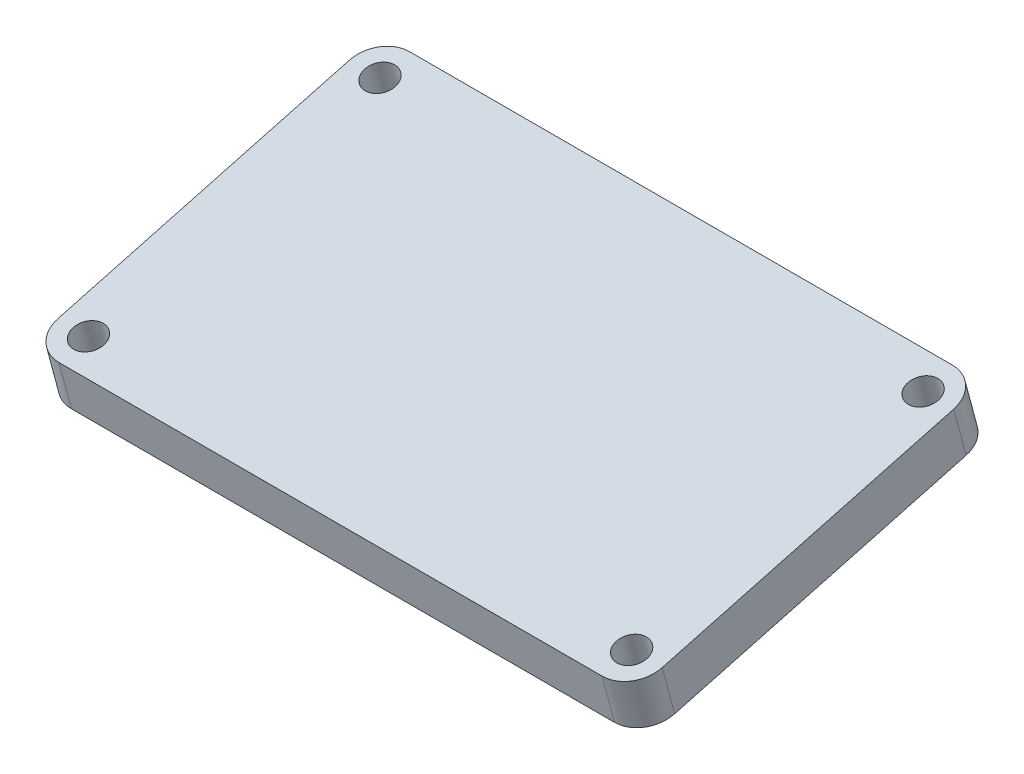
ISO-10303-21;
HEADER;
FILE_DESCRIPTION(('STEP AP214'),'2;1');
FILE_NAME('part.step','',(''),(''),'','','');
FILE_SCHEMA(('AUTOMOTIVE_DESIGN { 1 0 10303 214 1 1 1 1 }'));
ENDSEC;
DATA;
#1=APPLICATION_CONTEXT('core data for automotive mechanical design processes');
#2=APPLICATION_PROTOCOL_DEFINITION('international standard','automotive_design',2000,#1);
#3=PRODUCT_CONTEXT('',#1,'mechanical');
#4=PRODUCT('Part','Part','',(#3));
#5=PRODUCT_RELATED_PRODUCT_CATEGORY('part','',(#4));
#6=PRODUCT_DEFINITION_FORMATION('','',#4);
#7=PRODUCT_DEFINITION_CONTEXT('part definition',#1,'design');
#8=PRODUCT_DEFINITION('design','',#6,#7);
#9=PRODUCT_DEFINITION_SHAPE('','',#8);
#10=(LENGTH_UNIT() NAMED_UNIT(*) SI_UNIT(.MILLI.,.METRE.));
#11=(NAMED_UNIT(*) PLANE_ANGLE_UNIT() SI_UNIT($,.RADIAN.));
#12=(NAMED_UNIT(*) SI_UNIT($,.STERADIAN.) SOLID_ANGLE_UNIT());
#13=UNCERTAINTY_MEASURE_WITH_UNIT(LENGTH_MEASURE(1.E-05),#10,'distance_accuracy_value','');
#14=(GEOMETRIC_REPRESENTATION_CONTEXT(3) GLOBAL_UNCERTAINTY_ASSIGNED_CONTEXT((#13)) GLOBAL_UNIT_ASSIGNED_CONTEXT((#10,
#11,#12)) REPRESENTATION_CONTEXT('',''));
#15=CARTESIAN_POINT('',(0.,0.,0.));
#16=DIRECTION('',(0.,0.,1.));
#17=DIRECTION('',(1.,0.,0.));
#18=AXIS2_PLACEMENT_3D('',#15,#16,#17);
#19=CARTESIAN_POINT('',(40.0538061,293.775918617498,406.13245097417));
#20=DIRECTION('',(1.,0.,0.));
#21=DIRECTION('',(0.,0.,-1.));
#22=AXIS2_PLACEMENT_3D('',#19,#20,#21);
#23=PLANE('',#22);
#24=DIRECTION('',(0.,0.258819045102521,-0.965925826289068));
#25=VECTOR('',#24,1.);
#26=CARTESIAN_POINT('',(40.0538061,299.909547614434,407.775951910571));
#27=LINE('',#26,#25);
#28=CARTESIAN_POINT('',(40.0538061,294.733166712383,427.094468436353));
#29=VERTEX_POINT('',#28);
#30=CARTESIAN_POINT('',(40.0538061,305.085928516484,388.45743538479));
#31=VERTEX_POINT('',#30);
#32=EDGE_CURVE('E145',#29,#31,#27,.T.);
#33=ORIENTED_EDGE('',*,*,#32,.F.);
#34=DIRECTION('',(0.,0.965925826289068,0.258819045102521));
#35=VECTOR('',#34,1.);
#36=CARTESIAN_POINT('',(40.0538061,288.599537715447,425.450967499952));
#37=LINE('',#36,#35);
#38=CARTESIAN_POINT('',(40.0538061,288.599537715447,425.450967499952));
#39=VERTEX_POINT('',#38);
#40=EDGE_CURVE('E11',#39,#29,#37,.T.);
#41=ORIENTED_EDGE('',*,*,#40,.F.);
#42=DIRECTION('',(0.,0.258819045102521,-0.965925826289068));
#43=VECTOR('',#42,1.);
#44=CARTESIAN_POINT('',(40.0538061,293.775918617498,406.13245097417));
#45=LINE('',#44,#43);
#46=CARTESIAN_POINT('',(40.0538061,298.952299519548,386.813934448389));
#47=VERTEX_POINT('',#46);
#48=EDGE_CURVE('E328',#39,#47,#45,.T.);
#49=ORIENTED_EDGE('',*,*,#48,.T.);
#50=DIRECTION('',(0.,0.965925826289068,0.258819045102521));
#51=VECTOR('',#50,1.);
#52=CARTESIAN_POINT('',(40.0538061,298.952299519548,386.813934448389));
#53=LINE('',#52,#51);
#54=EDGE_CURVE('E69',#47,#31,#53,.T.);
#55=ORIENTED_EDGE('',*,*,#54,.T.);
#56=EDGE_LOOP('',(#33,#41,#49,#55));
#57=FACE_BOUND('',#56,.T.);
#58=ADVANCED_FACE('F17',(#57),#23,.T.);
#59=CARTESIAN_POINT('',(36.0000061,288.599537715447,425.450967499952));
#60=DIRECTION('',(0.,0.965925826289068,0.258819045102521));
#61=DIRECTION('',(0.,-0.258819045102521,0.965925826289068));
#62=AXIS2_PLACEMENT_3D('',#59,#60,#61);
#63=CYLINDRICAL_SURFACE('',#62,4.05380000000005);
#64=CARTESIAN_POINT('',(36.0000061,294.733166712383,427.094468436353));
#65=DIRECTION('',(0.,-0.965925826289068,-0.258819045102521));
#66=DIRECTION('',(0.,0.258819045102521,-0.965925826289068));
#67=AXIS2_PLACEMENT_3D('',#64,#65,#66);
#68=CIRCLE('',#67,4.05380000000005);
#69=CARTESIAN_POINT('',(36.0000061,293.683966067347,431.010138550963));
#70=VERTEX_POINT('',#69);
#71=EDGE_CURVE('E142',#29,#70,#68,.T.);
#72=ORIENTED_EDGE('',*,*,#71,.T.);
#73=DIRECTION('',(0.,0.965925826289068,0.258819045102521));
#74=VECTOR('',#73,1.);
#75=CARTESIAN_POINT('',(36.0000061,287.550337070411,429.366637614562));
#76=LINE('',#75,#74);
#77=CARTESIAN_POINT('',(36.0000061,287.550337070411,429.366637614562));
#78=VERTEX_POINT('',#77);
#79=EDGE_CURVE('E27',#78,#70,#76,.T.);
#80=ORIENTED_EDGE('',*,*,#79,.F.);
#81=CARTESIAN_POINT('',(36.0000061,288.599537715447,425.450967499952));
#82=DIRECTION('',(0.,-0.965925826289068,-0.258819045102521));
#83=DIRECTION('',(0.,0.258819045102521,-0.965925826289068));
#84=AXIS2_PLACEMENT_3D('',#81,#82,#83);
#85=CIRCLE('',#84,4.05380000000005);
#86=EDGE_CURVE('E324',#39,#78,#85,.T.);
#87=ORIENTED_EDGE('',*,*,#86,.F.);
#88=ORIENTED_EDGE('',*,*,#40,.T.);
#89=EDGE_LOOP('',(#72,#80,#87,#88));
#90=FACE_BOUND('',#89,.T.);
#91=ADVANCED_FACE('F143',(#90),#63,.T.);
#92=CARTESIAN_POINT('',(0.,287.550337070411,429.366637614562));
#93=DIRECTION('',(0.,-0.258819045102521,0.965925826289068));
#94=DIRECTION('',(0.,-0.965925826289068,-0.258819045102521));
#95=AXIS2_PLACEMENT_3D('',#92,#93,#94);
#96=PLANE('',#95);
#97=DIRECTION('',(1.,0.,0.));
#98=VECTOR('',#97,1.);
#99=CARTESIAN_POINT('',(0.,293.683966067347,431.010138550963));
#100=LINE('',#99,#98);
#101=CARTESIAN_POINT('',(-36.0000061,293.683966067347,431.010138550963));
#102=VERTEX_POINT('',#101);
#103=EDGE_CURVE('E137',#102,#70,#100,.T.);
#104=ORIENTED_EDGE('',*,*,#103,.F.);
#105=DIRECTION('',(0.,0.965925826289068,0.258819045102521));
#106=VECTOR('',#105,1.);
#107=CARTESIAN_POINT('',(-36.0000061,287.550337070411,429.366637614562));
#108=LINE('',#107,#106);
#109=CARTESIAN_POINT('',(-36.0000061,287.550337070411,429.366637614562));
#110=VERTEX_POINT('',#109);
#111=EDGE_CURVE('E126',#110,#102,#108,.T.);
#112=ORIENTED_EDGE('',*,*,#111,.F.);
#113=DIRECTION('',(1.,0.,0.));
#114=VECTOR('',#113,1.);
#115=CARTESIAN_POINT('',(0.,287.550337070411,429.366637614562));
#116=LINE('',#115,#114);
#117=EDGE_CURVE('E139',#110,#78,#116,.T.);
#118=ORIENTED_EDGE('',*,*,#117,.T.);
#119=ORIENTED_EDGE('',*,*,#79,.T.);
#120=EDGE_LOOP('',(#104,#112,#118,#119));
#121=FACE_BOUND('',#120,.T.);
#122=ADVANCED_FACE('F135',(#121),#96,.T.);
#123=CARTESIAN_POINT('',(-36.0000060999999,288.599537715447,425.450967499952));
#124=DIRECTION('',(0.,0.965925826289068,0.258819045102521));
#125=DIRECTION('',(0.,-0.258819045102521,0.965925826289068));
#126=AXIS2_PLACEMENT_3D('',#123,#124,#125);
#127=CYLINDRICAL_SURFACE('',#126,4.05380000000005);
#128=CARTESIAN_POINT('',(-36.0000060999999,294.733166712383,427.094468436353));
#129=DIRECTION('',(0.,-0.965925826289068,-0.258819045102521));
#130=DIRECTION('',(0.,0.258819045102521,-0.965925826289068));
#131=AXIS2_PLACEMENT_3D('',#128,#129,#130);
#132=CIRCLE('',#131,4.05380000000005);
#133=CARTESIAN_POINT('',(-40.0538061,294.733166712383,427.094468436353));
#134=VERTEX_POINT('',#133);
#135=EDGE_CURVE('E150',#102,#134,#132,.T.);
#136=ORIENTED_EDGE('',*,*,#135,.T.);
#137=DIRECTION('',(0.,0.965925826289068,0.258819045102521));
#138=VECTOR('',#137,1.);
#139=CARTESIAN_POINT('',(-40.0538061,288.599537715447,425.450967499952));
#140=LINE('',#139,#138);
#141=CARTESIAN_POINT('',(-40.0538061,288.599537715447,425.450967499952));
#142=VERTEX_POINT('',#141);
#143=EDGE_CURVE('E117',#142,#134,#140,.T.);
#144=ORIENTED_EDGE('',*,*,#143,.F.);
#145=CARTESIAN_POINT('',(-36.0000060999999,288.599537715447,425.450967499952));
#146=DIRECTION('',(0.,-0.965925826289068,-0.258819045102521));
#147=DIRECTION('',(0.,0.258819045102521,-0.965925826289068));
#148=AXIS2_PLACEMENT_3D('',#145,#146,#147);
#149=CIRCLE('',#148,4.05380000000005);
#150=EDGE_CURVE('E321',#110,#142,#149,.T.);
#151=ORIENTED_EDGE('',*,*,#150,.F.);
#152=ORIENTED_EDGE('',*,*,#111,.T.);
#153=EDGE_LOOP('',(#136,#144,#151,#152));
#154=FACE_BOUND('',#153,.T.);
#155=ADVANCED_FACE('F239',(#154),#127,.T.);
#156=CARTESIAN_POINT('',(-40.0538061,293.775918617498,406.13245097417));
#157=DIRECTION('',(1.,0.,0.));
#158=DIRECTION('',(0.,0.,-1.));
#159=AXIS2_PLACEMENT_3D('',#156,#157,#158);
#160=PLANE('',#159);
#161=DIRECTION('',(0.,0.258819045102521,-0.965925826289068));
#162=VECTOR('',#161,1.);
#163=CARTESIAN_POINT('',(-40.0538061,299.909547614434,407.775951910571));
#164=LINE('',#163,#162);
#165=CARTESIAN_POINT('',(-40.0538061,305.085928516484,388.45743538479));
#166=VERTEX_POINT('',#165);
#167=EDGE_CURVE('E153',#134,#166,#164,.T.);
#168=ORIENTED_EDGE('',*,*,#167,.T.);
#169=DIRECTION('',(0.,0.965925826289068,0.258819045102521));
#170=VECTOR('',#169,1.);
#171=CARTESIAN_POINT('',(-40.0538061,298.952299519548,386.813934448389));
#172=LINE('',#171,#170);
#173=CARTESIAN_POINT('',(-40.0538061,298.952299519548,386.813934448389));
#174=VERTEX_POINT('',#173);
#175=EDGE_CURVE('E112',#174,#166,#172,.T.);
#176=ORIENTED_EDGE('',*,*,#175,.F.);
#177=DIRECTION('',(0.,0.258819045102521,-0.965925826289068));
#178=VECTOR('',#177,1.);
#179=CARTESIAN_POINT('',(-40.0538061,293.775918617498,406.13245097417));
#180=LINE('',#179,#178);
#181=EDGE_CURVE('E103',#142,#174,#180,.T.);
#182=ORIENTED_EDGE('',*,*,#181,.F.);
#183=ORIENTED_EDGE('',*,*,#143,.T.);
#184=EDGE_LOOP('',(#168,#176,#182,#183));
#185=FACE_BOUND('',#184,.T.);
#186=ADVANCED_FACE('F236',(#185),#160,.F.);
#187=CARTESIAN_POINT('',(-36.0000061000001,298.952299519548,386.813934448389));
#188=DIRECTION('',(0.,0.965925826289068,0.258819045102521));
#189=DIRECTION('',(0.,-0.258819045102521,0.965925826289068));
#190=AXIS2_PLACEMENT_3D('',#187,#188,#189);
#191=CYLINDRICAL_SURFACE('',#190,4.0538);
#192=CARTESIAN_POINT('',(-36.0000061000001,305.085928516484,388.45743538479));
#193=DIRECTION('',(0.,-0.965925826289068,-0.258819045102521));
#194=DIRECTION('',(0.,0.258819045102521,-0.965925826289068));
#195=AXIS2_PLACEMENT_3D('',#192,#193,#194);
#196=CIRCLE('',#195,4.0538);
#197=CARTESIAN_POINT('',(-36.0000061,306.135129161521,384.541765270179));
#198=VERTEX_POINT('',#197);
#199=EDGE_CURVE('E110',#166,#198,#196,.T.);
#200=ORIENTED_EDGE('',*,*,#199,.T.);
#201=DIRECTION('',(0.,0.965925826289068,0.258819045102521));
#202=VECTOR('',#201,1.);
#203=CARTESIAN_POINT('',(-36.0000061,300.001500164585,382.898264333778));
#204=LINE('',#203,#202);
#205=CARTESIAN_POINT('',(-36.0000061,300.001500164585,382.898264333778));
#206=VERTEX_POINT('',#205);
#207=EDGE_CURVE('E94',#206,#198,#204,.T.);
#208=ORIENTED_EDGE('',*,*,#207,.F.);
#209=CARTESIAN_POINT('',(-36.0000061000001,298.952299519548,386.813934448389));
#210=DIRECTION('',(0.,-0.965925826289068,-0.258819045102521));
#211=DIRECTION('',(0.,0.258819045102521,-0.965925826289068));
#212=AXIS2_PLACEMENT_3D('',#209,#210,#211);
#213=CIRCLE('',#212,4.0538);
#214=EDGE_CURVE('E98',#174,#206,#213,.T.);
#215=ORIENTED_EDGE('',*,*,#214,.F.);
#216=ORIENTED_EDGE('',*,*,#175,.T.);
#217=EDGE_LOOP('',(#200,#208,#215,#216));
#218=FACE_BOUND('',#217,.T.);
#219=ADVANCED_FACE('F109',(#218),#191,.T.);
#220=CARTESIAN_POINT('',(0.,300.001500164585,382.898264333778));
#221=DIRECTION('',(0.,-0.258819045102521,0.965925826289068));
#222=DIRECTION('',(0.,-0.965925826289068,-0.258819045102521));
#223=AXIS2_PLACEMENT_3D('',#220,#221,#222);
#224=PLANE('',#223);
#225=DIRECTION('',(1.,0.,0.));
#226=VECTOR('',#225,1.);
#227=CARTESIAN_POINT('',(0.,306.135129161521,384.541765270179));
#228=LINE('',#227,#226);
#229=CARTESIAN_POINT('',(36.0000061,306.135129161521,384.541765270179));
#230=VERTEX_POINT('',#229);
#231=EDGE_CURVE('E162',#198,#230,#228,.T.);
#232=ORIENTED_EDGE('',*,*,#231,.T.);
#233=DIRECTION('',(0.,0.965925826289068,0.258819045102521));
#234=VECTOR('',#233,1.);
#235=CARTESIAN_POINT('',(36.0000061,300.001500164585,382.898264333778));
#236=LINE('',#235,#234);
#237=CARTESIAN_POINT('',(36.0000061,300.001500164585,382.898264333778));
#238=VERTEX_POINT('',#237);
#239=EDGE_CURVE('E96',#238,#230,#236,.T.);
#240=ORIENTED_EDGE('',*,*,#239,.F.);
#241=DIRECTION('',(1.,0.,0.));
#242=VECTOR('',#241,1.);
#243=CARTESIAN_POINT('',(0.,300.001500164585,382.898264333778));
#244=LINE('',#243,#242);
#245=EDGE_CURVE('E89',#206,#238,#244,.T.);
#246=ORIENTED_EDGE('',*,*,#245,.F.);
#247=ORIENTED_EDGE('',*,*,#207,.T.);
#248=EDGE_LOOP('',(#232,#240,#246,#247));
#249=FACE_BOUND('',#248,.T.);
#250=ADVANCED_FACE('F92',(#249),#224,.F.);
#251=CARTESIAN_POINT('',(-36.,288.599537715447,425.450967499952));
#252=DIRECTION('',(0.,0.965925826289068,0.258819045102521));
#253=DIRECTION('',(0.,-0.258819045102521,0.965925826289068));
#254=AXIS2_PLACEMENT_3D('',#251,#252,#253);
#255=CYLINDRICAL_SURFACE('',#254,2.0193);
#256=CARTESIAN_POINT('',(-36.,288.599537715447,425.450967499952));
#257=DIRECTION('',(0.,-0.965925826289068,-0.258819045102521));
#258=DIRECTION('',(0.,0.258819045102521,-0.965925826289068));
#259=AXIS2_PLACEMENT_3D('',#256,#257,#258);
#260=CIRCLE('',#259,2.0193);
#261=CARTESIAN_POINT('',(-36.,288.076904417672,427.401461520977));
#262=VERTEX_POINT('',#261);
#263=EDGE_CURVE('E337',#262,#262,#260,.T.);
#264=CARTESIAN_POINT('',(-36.,294.733166712383,427.094468436353));
#265=DIRECTION('',(0.,-0.965925826289068,-0.258819045102521));
#266=DIRECTION('',(0.,0.258819045102521,-0.965925826289068));
#267=AXIS2_PLACEMENT_3D('',#264,#265,#266);
#268=CIRCLE('',#267,2.0193);
#269=CARTESIAN_POINT('',(-36.,294.210533414607,429.044962457378));
#270=VERTEX_POINT('',#269);
#271=EDGE_CURVE('E182',#270,#270,#268,.T.);
#272=CARTESIAN_POINT('',(-36.,288.076904417672,427.401461520977));
#273=CARTESIAN_POINT('',(-36.,288.14079638639,427.418581322398));
#274=CARTESIAN_POINT('',(-36.,288.204688355108,427.435701123819));
#275=CARTESIAN_POINT('',(-36.,288.332472292544,427.46994072666));
#276=CARTESIAN_POINT('',(-36.,288.396364261262,427.487060528081));
#277=CARTESIAN_POINT('',(-36.,288.524148198698,427.521300130923));
#278=CARTESIAN_POINT('',(-36.,288.588040167417,427.538419932344));
#279=CARTESIAN_POINT('',(-36.,288.715824104853,427.572659535185));
#280=CARTESIAN_POINT('',(-36.,288.779716073571,427.589779336606));
#281=CARTESIAN_POINT('',(-36.,288.907500011007,427.624018939448));
#282=CARTESIAN_POINT('',(-36.,288.971391979725,427.641138740869));
#283=CARTESIAN_POINT('',(-36.,289.099175917161,427.675378343711));
#284=CARTESIAN_POINT('',(-36.,289.163067885879,427.692498145131));
#285=CARTESIAN_POINT('',(-36.,289.290851823315,427.726737747973));
#286=CARTESIAN_POINT('',(-36.,289.354743792034,427.743857549394));
#287=CARTESIAN_POINT('',(-36.,289.48252772947,427.778097152236));
#288=CARTESIAN_POINT('',(-36.,289.546419698188,427.795216953656));
#289=CARTESIAN_POINT('',(-36.,289.674203635624,427.829456556498));
#290=CARTESIAN_POINT('',(-36.,289.738095604342,427.846576357919));
#291=CARTESIAN_POINT('',(-36.,289.865879541778,427.880815960761));
#292=CARTESIAN_POINT('',(-36.,289.929771510496,427.897935762182));
#293=CARTESIAN_POINT('',(-36.,290.057555447932,427.932175365023));
#294=CARTESIAN_POINT('',(-36.,290.12144741665,427.949295166444));
#295=CARTESIAN_POINT('',(-36.,290.249231354087,427.983534769286));
#296=CARTESIAN_POINT('',(-36.,290.313123322805,428.000654570707));
#297=CARTESIAN_POINT('',(-36.,290.440907260241,428.034894173548));
#298=CARTESIAN_POINT('',(-36.,290.504799228959,428.052013974969));
#299=CARTESIAN_POINT('',(-36.,290.632583166395,428.086253577811));
#300=CARTESIAN_POINT('',(-36.,290.696475135113,428.103373379232));
#301=CARTESIAN_POINT('',(-36.,290.824259072549,428.137612982073));
#302=CARTESIAN_POINT('',(-36.,290.888151041267,428.154732783494));
#303=CARTESIAN_POINT('',(-36.,291.015934978704,428.188972386336));
#304=CARTESIAN_POINT('',(-36.,291.079826947422,428.206092187757));
#305=CARTESIAN_POINT('',(-36.,291.207610884858,428.240331790598));
#306=CARTESIAN_POINT('',(-36.,291.271502853576,428.257451592019));
#307=CARTESIAN_POINT('',(-36.,291.399286791012,428.291691194861));
#308=CARTESIAN_POINT('',(-36.,291.46317875973,428.308810996282));
#309=CARTESIAN_POINT('',(-36.,291.590962697166,428.343050599124));
#310=CARTESIAN_POINT('',(-36.,291.654854665884,428.360170400544));
#311=CARTESIAN_POINT('',(-36.,291.78263860332,428.394410003386));
#312=CARTESIAN_POINT('',(-36.,291.846530572039,428.411529804807));
#313=CARTESIAN_POINT('',(-36.,291.974314509475,428.445769407649));
#314=CARTESIAN_POINT('',(-36.,292.038206478193,428.462889209069));
#315=CARTESIAN_POINT('',(-36.,292.165990415629,428.497128811911));
#316=CARTESIAN_POINT('',(-36.,292.229882384347,428.514248613332));
#317=CARTESIAN_POINT('',(-36.,292.357666321783,428.548488216174));
#318=CARTESIAN_POINT('',(-36.,292.421558290501,428.565608017594));
#319=CARTESIAN_POINT('',(-36.,292.549342227937,428.599847620436));
#320=CARTESIAN_POINT('',(-36.,292.613234196655,428.616967421857));
#321=CARTESIAN_POINT('',(-36.,292.741018134092,428.651207024699));
#322=CARTESIAN_POINT('',(-36.,292.80491010281,428.668326826119));
#323=CARTESIAN_POINT('',(-36.,292.932694040246,428.702566428961));
#324=CARTESIAN_POINT('',(-36.,292.996586008964,428.719686230382));
#325=CARTESIAN_POINT('',(-36.,293.1243699464,428.753925833224));
#326=CARTESIAN_POINT('',(-36.,293.188261915118,428.771045634645));
#327=CARTESIAN_POINT('',(-36.,293.316045852554,428.805285237486));
#328=CARTESIAN_POINT('',(-36.,293.379937821272,428.822405038907));
#329=CARTESIAN_POINT('',(-36.,293.507721758709,428.856644641749));
#330=CARTESIAN_POINT('',(-36.,293.571613727427,428.87376444317));
#331=CARTESIAN_POINT('',(-36.,293.699397664863,428.908004046011));
#332=CARTESIAN_POINT('',(-36.,293.763289633581,428.925123847432));
#333=CARTESIAN_POINT('',(-36.,293.891073571017,428.959363450274));
#334=CARTESIAN_POINT('',(-36.,293.954965539735,428.976483251695));
#335=CARTESIAN_POINT('',(-36.,294.082749477171,429.010722854536));
#336=CARTESIAN_POINT('',(-36.,294.146641445889,429.027842655957));
#337=CARTESIAN_POINT('',(-36.,294.210533414607,429.044962457378));
#338=B_SPLINE_CURVE_WITH_KNOTS('',3,(#272,#273,#274,#275,#276,#277,#278,#279,#280,#281,#282,
#283,#284,#285,#286,#287,#288,#289,#290,#291,#292,#293,#294,#295,#296,#297,#298,#299,#300,#301,
#302,#303,#304,#305,#306,#307,#308,#309,#310,#311,#312,#313,#314,#315,#316,#317,#318,#319,#320,
#321,#322,#323,#324,#325,#326,#327,#328,#329,#330,#331,#332,#333,#334,#335,#336,#337),
.UNSPECIFIED.,.F.,.F.,(4,2,2,2,2,2,2,2,2,2,2,2,2,2,2,2,2,2,2,2,2,2,2,2,2,2,2,2,2,2,2,2,4),(0.,
0.198437499999976,0.396874999999937,0.595312499999967,0.793749999999943,0.992187499999972,
1.19062499999995,1.38906249999998,1.58749999999994,1.78593749999992,1.98437499999994,
2.18281249999992,2.38124999999995,2.57968749999991,2.77812499999994,2.97656249999992,
3.17499999999989,3.37343749999992,3.5718749999999,3.77031249999991,3.96874999999989,
4.16718749999992,4.36562499999989,4.56406249999992,4.76249999999988,4.96093749999986,
5.15937499999989,5.35781249999987,5.55624999999989,5.75468749999986,5.95312499999989,
6.15156249999986,6.34999999999984),.UNSPECIFIED.);
#339=EDGE_CURVE('BSEAM195',#262,#270,#338,.T.);
#340=ORIENTED_EDGE('',*,*,#263,.T.);
#341=ORIENTED_EDGE('',*,*,#271,.F.);
#342=ORIENTED_EDGE('',*,*,#339,.T.);
#343=ORIENTED_EDGE('',*,*,#339,.F.);
#344=EDGE_LOOP('',(#340,#342,#341,#343));
#345=FACE_BOUND('',#344,.T.);
#346=ADVANCED_FACE('F195',(#345),#255,.F.);
#347=CARTESIAN_POINT('',(-36.,298.952299519548,386.813934448389));
#348=DIRECTION('',(0.,0.965925826289068,0.258819045102521));
#349=DIRECTION('',(0.,-0.258819045102521,0.965925826289068));
#350=AXIS2_PLACEMENT_3D('',#347,#348,#349);
#351=CYLINDRICAL_SURFACE('',#350,2.0193);
#352=CARTESIAN_POINT('',(-36.,298.952299519548,386.813934448389));
#353=DIRECTION('',(0.,-0.965925826289068,-0.258819045102521));
#354=DIRECTION('',(0.,0.258819045102521,-0.965925826289068));
#355=AXIS2_PLACEMENT_3D('',#352,#353,#354);
#356=CIRCLE('',#355,2.0193);
#357=CARTESIAN_POINT('',(-36.,298.429666221773,388.764428469415));
#358=VERTEX_POINT('',#357);
#359=EDGE_CURVE('E338',#358,#358,#356,.T.);
#360=CARTESIAN_POINT('',(-36.,305.085928516484,388.45743538479));
#361=DIRECTION('',(0.,-0.965925826289068,-0.258819045102521));
#362=DIRECTION('',(0.,0.258819045102521,-0.965925826289068));
#363=AXIS2_PLACEMENT_3D('',#360,#361,#362);
#364=CIRCLE('',#363,2.0193);
#365=CARTESIAN_POINT('',(-36.,304.563295218708,390.407929405816));
#366=VERTEX_POINT('',#365);
#367=EDGE_CURVE('E179',#366,#366,#364,.T.);
#368=CARTESIAN_POINT('',(-36.,298.429666221773,388.764428469415));
#369=CARTESIAN_POINT('',(-36.,298.493558190491,388.781548270835));
#370=CARTESIAN_POINT('',(-36.,298.557450159209,388.798668072256));
#371=CARTESIAN_POINT('',(-36.,298.685234096645,388.832907675098));
#372=CARTESIAN_POINT('',(-36.,298.749126065363,388.850027476519));
#373=CARTESIAN_POINT('',(-36.,298.876910002799,388.88426707936));
#374=CARTESIAN_POINT('',(-36.,298.940801971518,388.901386880781));
#375=CARTESIAN_POINT('',(-36.,299.068585908954,388.935626483623));
#376=CARTESIAN_POINT('',(-36.,299.132477877672,388.952746285044));
#377=CARTESIAN_POINT('',(-36.,299.260261815108,388.986985887886));
#378=CARTESIAN_POINT('',(-36.,299.324153783826,389.004105689306));
#379=CARTESIAN_POINT('',(-36.,299.451937721262,389.038345292148));
#380=CARTESIAN_POINT('',(-36.,299.51582968998,389.055465093569));
#381=CARTESIAN_POINT('',(-36.,299.643613627416,389.089704696411));
#382=CARTESIAN_POINT('',(-36.,299.707505596135,389.106824497831));
#383=CARTESIAN_POINT('',(-36.,299.835289533571,389.141064100673));
#384=CARTESIAN_POINT('',(-36.,299.899181502289,389.158183902094));
#385=CARTESIAN_POINT('',(-36.,300.026965439725,389.192423504936));
#386=CARTESIAN_POINT('',(-36.,300.090857408443,389.209543306356));
#387=CARTESIAN_POINT('',(-36.,300.218641345879,389.243782909198));
#388=CARTESIAN_POINT('',(-36.,300.282533314597,389.260902710619));
#389=CARTESIAN_POINT('',(-36.,300.410317252033,389.295142313461));
#390=CARTESIAN_POINT('',(-36.,300.474209220751,389.312262114882));
#391=CARTESIAN_POINT('',(-36.,300.601993158188,389.346501717723));
#392=CARTESIAN_POINT('',(-36.,300.665885126906,389.363621519144));
#393=CARTESIAN_POINT('',(-36.,300.793669064342,389.397861121986));
#394=CARTESIAN_POINT('',(-36.,300.85756103306,389.414980923407));
#395=CARTESIAN_POINT('',(-36.,300.985344970496,389.449220526248));
#396=CARTESIAN_POINT('',(-36.,301.049236939214,389.466340327669));
#397=CARTESIAN_POINT('',(-36.,301.17702087665,389.500579930511));
#398=CARTESIAN_POINT('',(-36.,301.240912845368,389.517699731932));
#399=CARTESIAN_POINT('',(-36.,301.368696782805,389.551939334773));
#400=CARTESIAN_POINT('',(-36.,301.432588751523,389.569059136194));
#401=CARTESIAN_POINT('',(-36.,301.560372688959,389.603298739036));
#402=CARTESIAN_POINT('',(-36.,301.624264657677,389.620418540457));
#403=CARTESIAN_POINT('',(-36.,301.752048595113,389.654658143298));
#404=CARTESIAN_POINT('',(-36.,301.815940563831,389.671777944719));
#405=CARTESIAN_POINT('',(-36.,301.943724501267,389.706017547561));
#406=CARTESIAN_POINT('',(-36.,302.007616469985,389.723137348982));
#407=CARTESIAN_POINT('',(-36.,302.135400407421,389.757376951823));
#408=CARTESIAN_POINT('',(-36.,302.19929237614,389.774496753244));
#409=CARTESIAN_POINT('',(-36.,302.327076313576,389.808736356086));
#410=CARTESIAN_POINT('',(-36.,302.390968282294,389.825856157507));
#411=CARTESIAN_POINT('',(-36.,302.51875221973,389.860095760349));
#412=CARTESIAN_POINT('',(-36.,302.582644188448,389.877215561769));
#413=CARTESIAN_POINT('',(-36.,302.710428125884,389.911455164611));
#414=CARTESIAN_POINT('',(-36.,302.774320094602,389.928574966032));
#415=CARTESIAN_POINT('',(-36.,302.902104032038,389.962814568874));
#416=CARTESIAN_POINT('',(-36.,302.965996000757,389.979934370294));
#417=CARTESIAN_POINT('',(-36.,303.093779938193,390.014173973136));
#418=CARTESIAN_POINT('',(-36.,303.157671906911,390.031293774557));
#419=CARTESIAN_POINT('',(-36.,303.285455844347,390.065533377399));
#420=CARTESIAN_POINT('',(-36.,303.349347813065,390.082653178819));
#421=CARTESIAN_POINT('',(-36.,303.477131750501,390.116892781661));
#422=CARTESIAN_POINT('',(-36.,303.541023719219,390.134012583082));
#423=CARTESIAN_POINT('',(-36.,303.668807656655,390.168252185924));
#424=CARTESIAN_POINT('',(-36.,303.732699625373,390.185371987345));
#425=CARTESIAN_POINT('',(-36.,303.86048356281,390.219611590186));
#426=CARTESIAN_POINT('',(-36.,303.924375531528,390.236731391607));
#427=CARTESIAN_POINT('',(-36.,304.052159468964,390.270970994449));
#428=CARTESIAN_POINT('',(-36.,304.116051437682,390.28809079587));
#429=CARTESIAN_POINT('',(-36.,304.243835375118,390.322330398711));
#430=CARTESIAN_POINT('',(-36.,304.307727343836,390.339450200132));
#431=CARTESIAN_POINT('',(-36.,304.435511281272,390.373689802974));
#432=CARTESIAN_POINT('',(-36.,304.49940324999,390.390809604395));
#433=CARTESIAN_POINT('',(-36.,304.563295218708,390.407929405816));
#434=B_SPLINE_CURVE_WITH_KNOTS('',3,(#368,#369,#370,#371,#372,#373,#374,#375,#376,#377,#378,
#379,#380,#381,#382,#383,#384,#385,#386,#387,#388,#389,#390,#391,#392,#393,#394,#395,#396,#397,
#398,#399,#400,#401,#402,#403,#404,#405,#406,#407,#408,#409,#410,#411,#412,#413,#414,#415,#416,
#417,#418,#419,#420,#421,#422,#423,#424,#425,#426,#427,#428,#429,#430,#431,#432,#433),
.UNSPECIFIED.,.F.,.F.,(4,2,2,2,2,2,2,2,2,2,2,2,2,2,2,2,2,2,2,2,2,2,2,2,2,2,2,2,2,2,2,2,4),(0.,
0.198437500000029,0.396875000000005,0.595312500000021,0.793749999999996,0.992187500000026,
1.190625,1.38906250000003,1.58749999999999,1.78593750000002,1.984375,2.18281250000003,2.38125,
2.57968750000003,2.77812499999999,2.97656250000002,3.175,3.37343749999998,3.57187500000001,
3.77031249999997,3.96875,4.16718749999997,4.365625,4.56406249999998,4.76250000000001,
4.96093749999997,5.159375,5.35781249999997,5.55625,5.75468749999998,5.95312500000001,
6.15156249999997,6.34999999999994),.UNSPECIFIED.);
#435=EDGE_CURVE('BSEAM198',#358,#366,#434,.T.);
#436=ORIENTED_EDGE('',*,*,#359,.T.);
#437=ORIENTED_EDGE('',*,*,#367,.F.);
#438=ORIENTED_EDGE('',*,*,#435,.T.);
#439=ORIENTED_EDGE('',*,*,#435,.F.);
#440=EDGE_LOOP('',(#436,#438,#437,#439));
#441=FACE_BOUND('',#440,.T.);
#442=ADVANCED_FACE('F198',(#441),#351,.F.);
#443=CARTESIAN_POINT('',(36.,298.952299519548,386.813934448389));
#444=DIRECTION('',(0.,0.965925826289068,0.258819045102521));
#445=DIRECTION('',(0.,-0.258819045102521,0.965925826289068));
#446=AXIS2_PLACEMENT_3D('',#443,#444,#445);
#447=CYLINDRICAL_SURFACE('',#446,2.0193);
#448=CARTESIAN_POINT('',(36.,298.952299519548,386.813934448389));
#449=DIRECTION('',(0.,-0.965925826289068,-0.258819045102521));
#450=DIRECTION('',(0.,0.258819045102521,-0.965925826289068));
#451=AXIS2_PLACEMENT_3D('',#448,#449,#450);
#452=CIRCLE('',#451,2.0193);
#453=CARTESIAN_POINT('',(36.,298.429666221773,388.764428469415));
#454=VERTEX_POINT('',#453);
#455=EDGE_CURVE('E212',#454,#454,#452,.T.);
#456=CARTESIAN_POINT('',(36.,305.085928516484,388.45743538479));
#457=DIRECTION('',(0.,-0.965925826289068,-0.258819045102521));
#458=DIRECTION('',(0.,0.258819045102521,-0.965925826289068));
#459=AXIS2_PLACEMENT_3D('',#456,#457,#458);
#460=CIRCLE('',#459,2.0193);
#461=CARTESIAN_POINT('',(36.,304.563295218708,390.407929405816));
#462=VERTEX_POINT('',#461);
#463=EDGE_CURVE('E175',#462,#462,#460,.T.);
#464=CARTESIAN_POINT('',(36.,298.429666221773,388.764428469415));
#465=CARTESIAN_POINT('',(36.,298.493558190491,388.781548270835));
#466=CARTESIAN_POINT('',(36.,298.557450159209,388.798668072256));
#467=CARTESIAN_POINT('',(36.,298.685234096645,388.832907675098));
#468=CARTESIAN_POINT('',(36.,298.749126065363,388.850027476519));
#469=CARTESIAN_POINT('',(36.,298.876910002799,388.88426707936));
#470=CARTESIAN_POINT('',(36.,298.940801971518,388.901386880781));
#471=CARTESIAN_POINT('',(36.,299.068585908954,388.935626483623));
#472=CARTESIAN_POINT('',(36.,299.132477877672,388.952746285044));
#473=CARTESIAN_POINT('',(36.,299.260261815108,388.986985887886));
#474=CARTESIAN_POINT('',(36.,299.324153783826,389.004105689306));
#475=CARTESIAN_POINT('',(36.,299.451937721262,389.038345292148));
#476=CARTESIAN_POINT('',(36.,299.51582968998,389.055465093569));
#477=CARTESIAN_POINT('',(36.,299.643613627416,389.089704696411));
#478=CARTESIAN_POINT('',(36.,299.707505596135,389.106824497831));
#479=CARTESIAN_POINT('',(36.,299.835289533571,389.141064100673));
#480=CARTESIAN_POINT('',(36.,299.899181502289,389.158183902094));
#481=CARTESIAN_POINT('',(36.,300.026965439725,389.192423504936));
#482=CARTESIAN_POINT('',(36.,300.090857408443,389.209543306356));
#483=CARTESIAN_POINT('',(36.,300.218641345879,389.243782909198));
#484=CARTESIAN_POINT('',(36.,300.282533314597,389.260902710619));
#485=CARTESIAN_POINT('',(36.,300.410317252033,389.295142313461));
#486=CARTESIAN_POINT('',(36.,300.474209220751,389.312262114882));
#487=CARTESIAN_POINT('',(36.,300.601993158188,389.346501717723));
#488=CARTESIAN_POINT('',(36.,300.665885126906,389.363621519144));
#489=CARTESIAN_POINT('',(36.,300.793669064342,389.397861121986));
#490=CARTESIAN_POINT('',(36.,300.85756103306,389.414980923407));
#491=CARTESIAN_POINT('',(36.,300.985344970496,389.449220526248));
#492=CARTESIAN_POINT('',(36.,301.049236939214,389.466340327669));
#493=CARTESIAN_POINT('',(36.,301.17702087665,389.500579930511));
#494=CARTESIAN_POINT('',(36.,301.240912845368,389.517699731932));
#495=CARTESIAN_POINT('',(36.,301.368696782805,389.551939334773));
#496=CARTESIAN_POINT('',(36.,301.432588751523,389.569059136194));
#497=CARTESIAN_POINT('',(36.,301.560372688959,389.603298739036));
#498=CARTESIAN_POINT('',(36.,301.624264657677,389.620418540457));
#499=CARTESIAN_POINT('',(36.,301.752048595113,389.654658143298));
#500=CARTESIAN_POINT('',(36.,301.815940563831,389.671777944719));
#501=CARTESIAN_POINT('',(36.,301.943724501267,389.706017547561));
#502=CARTESIAN_POINT('',(36.,302.007616469985,389.723137348982));
#503=CARTESIAN_POINT('',(36.,302.135400407421,389.757376951823));
#504=CARTESIAN_POINT('',(36.,302.19929237614,389.774496753244));
#505=CARTESIAN_POINT('',(36.,302.327076313576,389.808736356086));
#506=CARTESIAN_POINT('',(36.,302.390968282294,389.825856157507));
#507=CARTESIAN_POINT('',(36.,302.51875221973,389.860095760349));
#508=CARTESIAN_POINT('',(36.,302.582644188448,389.877215561769));
#509=CARTESIAN_POINT('',(36.,302.710428125884,389.911455164611));
#510=CARTESIAN_POINT('',(36.,302.774320094602,389.928574966032));
#511=CARTESIAN_POINT('',(36.,302.902104032038,389.962814568874));
#512=CARTESIAN_POINT('',(36.,302.965996000757,389.979934370294));
#513=CARTESIAN_POINT('',(36.,303.093779938193,390.014173973136));
#514=CARTESIAN_POINT('',(36.,303.157671906911,390.031293774557));
#515=CARTESIAN_POINT('',(36.,303.285455844347,390.065533377399));
#516=CARTESIAN_POINT('',(36.,303.349347813065,390.082653178819));
#517=CARTESIAN_POINT('',(36.,303.477131750501,390.116892781661));
#518=CARTESIAN_POINT('',(36.,303.541023719219,390.134012583082));
#519=CARTESIAN_POINT('',(36.,303.668807656655,390.168252185924));
#520=CARTESIAN_POINT('',(36.,303.732699625373,390.185371987345));
#521=CARTESIAN_POINT('',(36.,303.86048356281,390.219611590186));
#522=CARTESIAN_POINT('',(36.,303.924375531528,390.236731391607));
#523=CARTESIAN_POINT('',(36.,304.052159468964,390.270970994449));
#524=CARTESIAN_POINT('',(36.,304.116051437682,390.28809079587));
#525=CARTESIAN_POINT('',(36.,304.243835375118,390.322330398711));
#526=CARTESIAN_POINT('',(36.,304.307727343836,390.339450200132));
#527=CARTESIAN_POINT('',(36.,304.435511281272,390.373689802974));
#528=CARTESIAN_POINT('',(36.,304.49940324999,390.390809604395));
#529=CARTESIAN_POINT('',(36.,304.563295218708,390.407929405816));
#530=B_SPLINE_CURVE_WITH_KNOTS('',3,(#464,#465,#466,#467,#468,#469,#470,#471,#472,#473,#474,
#475,#476,#477,#478,#479,#480,#481,#482,#483,#484,#485,#486,#487,#488,#489,#490,#491,#492,#493,
#494,#495,#496,#497,#498,#499,#500,#501,#502,#503,#504,#505,#506,#507,#508,#509,#510,#511,#512,
#513,#514,#515,#516,#517,#518,#519,#520,#521,#522,#523,#524,#525,#526,#527,#528,#529),
.UNSPECIFIED.,.F.,.F.,(4,2,2,2,2,2,2,2,2,2,2,2,2,2,2,2,2,2,2,2,2,2,2,2,2,2,2,2,2,2,2,2,4),(0.,
0.198437500000029,0.396875000000005,0.595312500000021,0.793749999999996,0.992187500000026,
1.190625,1.38906250000003,1.58749999999999,1.78593750000002,1.984375,2.18281250000003,2.38125,
2.57968750000003,2.77812499999999,2.97656250000002,3.175,3.37343749999998,3.57187500000001,
3.77031249999997,3.96875,4.16718749999997,4.365625,4.56406249999998,4.76250000000001,
4.96093749999997,5.159375,5.35781249999997,5.55625,5.75468749999998,5.95312500000001,
6.15156249999997,6.34999999999994),.UNSPECIFIED.);
#531=EDGE_CURVE('BSEAM201',#454,#462,#530,.T.);
#532=ORIENTED_EDGE('',*,*,#455,.T.);
#533=ORIENTED_EDGE('',*,*,#463,.F.);
#534=ORIENTED_EDGE('',*,*,#531,.T.);
#535=ORIENTED_EDGE('',*,*,#531,.F.);
#536=EDGE_LOOP('',(#532,#534,#533,#535));
#537=FACE_BOUND('',#536,.T.);
#538=ADVANCED_FACE('F201',(#537),#447,.F.);
#539=CARTESIAN_POINT('',(36.,288.599537715447,425.450967499952));
#540=DIRECTION('',(0.,0.965925826289068,0.258819045102521));
#541=DIRECTION('',(0.,-0.258819045102521,0.965925826289068));
#542=AXIS2_PLACEMENT_3D('',#539,#540,#541);
#543=CYLINDRICAL_SURFACE('',#542,2.0193);
#544=CARTESIAN_POINT('',(36.,288.599537715447,425.450967499952));
#545=DIRECTION('',(0.,-0.965925826289068,-0.258819045102521));
#546=DIRECTION('',(0.,0.258819045102521,-0.965925826289068));
#547=AXIS2_PLACEMENT_3D('',#544,#545,#546);
#548=CIRCLE('',#547,2.0193);
#549=CARTESIAN_POINT('',(36.,288.076904417672,427.401461520977));
#550=VERTEX_POINT('',#549);
#551=EDGE_CURVE('E166',#550,#550,#548,.T.);
#552=CARTESIAN_POINT('',(36.,294.733166712383,427.094468436353));
#553=DIRECTION('',(0.,-0.965925826289068,-0.258819045102521));
#554=DIRECTION('',(0.,0.258819045102521,-0.965925826289068));
#555=AXIS2_PLACEMENT_3D('',#552,#553,#554);
#556=CIRCLE('',#555,2.0193);
#557=CARTESIAN_POINT('',(36.,294.210533414607,429.044962457378));
#558=VERTEX_POINT('',#557);
#559=EDGE_CURVE('E171',#558,#558,#556,.T.);
#560=CARTESIAN_POINT('',(36.,288.076904417672,427.401461520977));
#561=CARTESIAN_POINT('',(36.,288.14079638639,427.418581322398));
#562=CARTESIAN_POINT('',(36.,288.204688355108,427.435701123819));
#563=CARTESIAN_POINT('',(36.,288.332472292544,427.46994072666));
#564=CARTESIAN_POINT('',(36.,288.396364261262,427.487060528081));
#565=CARTESIAN_POINT('',(36.,288.524148198698,427.521300130923));
#566=CARTESIAN_POINT('',(36.,288.588040167417,427.538419932344));
#567=CARTESIAN_POINT('',(36.,288.715824104853,427.572659535185));
#568=CARTESIAN_POINT('',(36.,288.779716073571,427.589779336606));
#569=CARTESIAN_POINT('',(36.,288.907500011007,427.624018939448));
#570=CARTESIAN_POINT('',(36.,288.971391979725,427.641138740869));
#571=CARTESIAN_POINT('',(36.,289.099175917161,427.675378343711));
#572=CARTESIAN_POINT('',(36.,289.163067885879,427.692498145131));
#573=CARTESIAN_POINT('',(36.,289.290851823315,427.726737747973));
#574=CARTESIAN_POINT('',(36.,289.354743792034,427.743857549394));
#575=CARTESIAN_POINT('',(36.,289.48252772947,427.778097152236));
#576=CARTESIAN_POINT('',(36.,289.546419698188,427.795216953656));
#577=CARTESIAN_POINT('',(36.,289.674203635624,427.829456556498));
#578=CARTESIAN_POINT('',(36.,289.738095604342,427.846576357919));
#579=CARTESIAN_POINT('',(36.,289.865879541778,427.880815960761));
#580=CARTESIAN_POINT('',(36.,289.929771510496,427.897935762182));
#581=CARTESIAN_POINT('',(36.,290.057555447932,427.932175365023));
#582=CARTESIAN_POINT('',(36.,290.12144741665,427.949295166444));
#583=CARTESIAN_POINT('',(36.,290.249231354087,427.983534769286));
#584=CARTESIAN_POINT('',(36.,290.313123322805,428.000654570707));
#585=CARTESIAN_POINT('',(36.,290.440907260241,428.034894173548));
#586=CARTESIAN_POINT('',(36.,290.504799228959,428.052013974969));
#587=CARTESIAN_POINT('',(36.,290.632583166395,428.086253577811));
#588=CARTESIAN_POINT('',(36.,290.696475135113,428.103373379232));
#589=CARTESIAN_POINT('',(36.,290.824259072549,428.137612982073));
#590=CARTESIAN_POINT('',(36.,290.888151041267,428.154732783494));
#591=CARTESIAN_POINT('',(36.,291.015934978704,428.188972386336));
#592=CARTESIAN_POINT('',(36.,291.079826947422,428.206092187757));
#593=CARTESIAN_POINT('',(36.,291.207610884858,428.240331790598));
#594=CARTESIAN_POINT('',(36.,291.271502853576,428.257451592019));
#595=CARTESIAN_POINT('',(36.,291.399286791012,428.291691194861));
#596=CARTESIAN_POINT('',(36.,291.46317875973,428.308810996282));
#597=CARTESIAN_POINT('',(36.,291.590962697166,428.343050599124));
#598=CARTESIAN_POINT('',(36.,291.654854665884,428.360170400544));
#599=CARTESIAN_POINT('',(36.,291.78263860332,428.394410003386));
#600=CARTESIAN_POINT('',(36.,291.846530572039,428.411529804807));
#601=CARTESIAN_POINT('',(36.,291.974314509475,428.445769407649));
#602=CARTESIAN_POINT('',(36.,292.038206478193,428.462889209069));
#603=CARTESIAN_POINT('',(36.,292.165990415629,428.497128811911));
#604=CARTESIAN_POINT('',(36.,292.229882384347,428.514248613332));
#605=CARTESIAN_POINT('',(36.,292.357666321783,428.548488216174));
#606=CARTESIAN_POINT('',(36.,292.421558290501,428.565608017594));
#607=CARTESIAN_POINT('',(36.,292.549342227937,428.599847620436));
#608=CARTESIAN_POINT('',(36.,292.613234196655,428.616967421857));
#609=CARTESIAN_POINT('',(36.,292.741018134092,428.651207024699));
#610=CARTESIAN_POINT('',(36.,292.80491010281,428.668326826119));
#611=CARTESIAN_POINT('',(36.,292.932694040246,428.702566428961));
#612=CARTESIAN_POINT('',(36.,292.996586008964,428.719686230382));
#613=CARTESIAN_POINT('',(36.,293.1243699464,428.753925833224));
#614=CARTESIAN_POINT('',(36.,293.188261915118,428.771045634645));
#615=CARTESIAN_POINT('',(36.,293.316045852554,428.805285237486));
#616=CARTESIAN_POINT('',(36.,293.379937821272,428.822405038907));
#617=CARTESIAN_POINT('',(36.,293.507721758709,428.856644641749));
#618=CARTESIAN_POINT('',(36.,293.571613727427,428.87376444317));
#619=CARTESIAN_POINT('',(36.,293.699397664863,428.908004046011));
#620=CARTESIAN_POINT('',(36.,293.763289633581,428.925123847432));
#621=CARTESIAN_POINT('',(36.,293.891073571017,428.959363450274));
#622=CARTESIAN_POINT('',(36.,293.954965539735,428.976483251695));
#623=CARTESIAN_POINT('',(36.,294.082749477171,429.010722854536));
#624=CARTESIAN_POINT('',(36.,294.146641445889,429.027842655957));
#625=CARTESIAN_POINT('',(36.,294.210533414607,429.044962457378));
#626=B_SPLINE_CURVE_WITH_KNOTS('',3,(#560,#561,#562,#563,#564,#565,#566,#567,#568,#569,#570,
#571,#572,#573,#574,#575,#576,#577,#578,#579,#580,#581,#582,#583,#584,#585,#586,#587,#588,#589,
#590,#591,#592,#593,#594,#595,#596,#597,#598,#599,#600,#601,#602,#603,#604,#605,#606,#607,#608,
#609,#610,#611,#612,#613,#614,#615,#616,#617,#618,#619,#620,#621,#622,#623,#624,#625),
.UNSPECIFIED.,.F.,.F.,(4,2,2,2,2,2,2,2,2,2,2,2,2,2,2,2,2,2,2,2,2,2,2,2,2,2,2,2,2,2,2,2,4),(0.,
0.198437499999976,0.396874999999937,0.595312499999967,0.793749999999943,0.992187499999972,
1.19062499999995,1.38906249999998,1.58749999999994,1.78593749999992,1.98437499999994,
2.18281249999992,2.38124999999995,2.57968749999991,2.77812499999994,2.97656249999992,
3.17499999999989,3.37343749999992,3.5718749999999,3.77031249999991,3.96874999999989,
4.16718749999992,4.36562499999989,4.56406249999992,4.76249999999988,4.96093749999986,
5.15937499999989,5.35781249999987,5.55624999999989,5.75468749999986,5.95312499999989,
6.15156249999986,6.34999999999984),.UNSPECIFIED.);
#627=EDGE_CURVE('BSEAM19',#550,#558,#626,.T.);
#628=ORIENTED_EDGE('',*,*,#551,.T.);
#629=ORIENTED_EDGE('',*,*,#559,.F.);
#630=ORIENTED_EDGE('',*,*,#627,.T.);
#631=ORIENTED_EDGE('',*,*,#627,.F.);
#632=EDGE_LOOP('',(#628,#630,#629,#631));
#633=FACE_BOUND('',#632,.T.);
#634=ADVANCED_FACE('F19',(#633),#543,.F.);
#635=CARTESIAN_POINT('',(36.0000061000001,298.952299519548,386.813934448389));
#636=DIRECTION('',(0.,0.965925826289068,0.258819045102521));
#637=DIRECTION('',(0.,-0.258819045102521,0.965925826289068));
#638=AXIS2_PLACEMENT_3D('',#635,#636,#637);
#639=CYLINDRICAL_SURFACE('',#638,4.0538);
#640=CARTESIAN_POINT('',(36.0000061000001,305.085928516484,388.45743538479));
#641=DIRECTION('',(0.,-0.965925826289068,-0.258819045102521));
#642=DIRECTION('',(0.,0.258819045102521,-0.965925826289068));
#643=AXIS2_PLACEMENT_3D('',#640,#641,#642);
#644=CIRCLE('',#643,4.0538);
#645=EDGE_CURVE('E62',#230,#31,#644,.T.);
#646=ORIENTED_EDGE('',*,*,#645,.T.);
#647=ORIENTED_EDGE('',*,*,#54,.F.);
#648=CARTESIAN_POINT('',(36.0000061000001,298.952299519548,386.813934448389));
#649=DIRECTION('',(0.,-0.965925826289068,-0.258819045102521));
#650=DIRECTION('',(0.,0.258819045102521,-0.965925826289068));
#651=AXIS2_PLACEMENT_3D('',#648,#649,#650);
#652=CIRCLE('',#651,4.0538);
#653=EDGE_CURVE('E35',#238,#47,#652,.T.);
#654=ORIENTED_EDGE('',*,*,#653,.F.);
#655=ORIENTED_EDGE('',*,*,#239,.T.);
#656=EDGE_LOOP('',(#646,#647,#654,#655));
#657=FACE_BOUND('',#656,.T.);
#658=ADVANCED_FACE('F207',(#657),#639,.T.);
#659=CARTESIAN_POINT('',(0.,293.775918617498,406.13245097417));
#660=DIRECTION('',(0.,-0.965925826289068,-0.258819045102521));
#661=DIRECTION('',(1.,0.,0.));
#662=AXIS2_PLACEMENT_3D('',#659,#660,#661);
#663=PLANE('',#662);
#664=ORIENTED_EDGE('',*,*,#551,.F.);
#665=EDGE_LOOP('',(#664));
#666=FACE_BOUND('',#665,.T.);
#667=ORIENTED_EDGE('',*,*,#455,.F.);
#668=EDGE_LOOP('',(#667));
#669=FACE_BOUND('',#668,.T.);
#670=ORIENTED_EDGE('',*,*,#359,.F.);
#671=EDGE_LOOP('',(#670));
#672=FACE_BOUND('',#671,.T.);
#673=ORIENTED_EDGE('',*,*,#263,.F.);
#674=EDGE_LOOP('',(#673));
#675=FACE_BOUND('',#674,.T.);
#676=ORIENTED_EDGE('',*,*,#48,.F.);
#677=ORIENTED_EDGE('',*,*,#86,.T.);
#678=ORIENTED_EDGE('',*,*,#117,.F.);
#679=ORIENTED_EDGE('',*,*,#150,.T.);
#680=ORIENTED_EDGE('',*,*,#181,.T.);
#681=ORIENTED_EDGE('',*,*,#214,.T.);
#682=ORIENTED_EDGE('',*,*,#245,.T.);
#683=ORIENTED_EDGE('',*,*,#653,.T.);
#684=EDGE_LOOP('',(#676,#677,#678,#679,#680,#681,#682,#683));
#685=FACE_BOUND('',#684,.T.);
#686=ADVANCED_FACE('F101',(#666,#669,#672,#675,#685),#663,.T.);
#687=CARTESIAN_POINT('',(0.,299.909547614434,407.775951910571));
#688=DIRECTION('',(0.,-0.965925826289068,-0.258819045102521));
#689=DIRECTION('',(1.,0.,0.));
#690=AXIS2_PLACEMENT_3D('',#687,#688,#689);
#691=PLANE('',#690);
#692=ORIENTED_EDGE('',*,*,#559,.T.);
#693=EDGE_LOOP('',(#692));
#694=FACE_BOUND('',#693,.T.);
#695=ORIENTED_EDGE('',*,*,#463,.T.);
#696=EDGE_LOOP('',(#695));
#697=FACE_BOUND('',#696,.T.);
#698=ORIENTED_EDGE('',*,*,#367,.T.);
#699=EDGE_LOOP('',(#698));
#700=FACE_BOUND('',#699,.T.);
#701=ORIENTED_EDGE('',*,*,#271,.T.);
#702=EDGE_LOOP('',(#701));
#703=FACE_BOUND('',#702,.T.);
#704=ORIENTED_EDGE('',*,*,#32,.T.);
#705=ORIENTED_EDGE('',*,*,#645,.F.);
#706=ORIENTED_EDGE('',*,*,#231,.F.);
#707=ORIENTED_EDGE('',*,*,#199,.F.);
#708=ORIENTED_EDGE('',*,*,#167,.F.);
#709=ORIENTED_EDGE('',*,*,#135,.F.);
#710=ORIENTED_EDGE('',*,*,#103,.T.);
#711=ORIENTED_EDGE('',*,*,#71,.F.);
#712=EDGE_LOOP('',(#704,#705,#706,#707,#708,#709,#710,#711));
#713=FACE_BOUND('',#712,.T.);
#714=ADVANCED_FACE('F148',(#694,#697,#700,#703,#713),#691,.F.);
#715=CLOSED_SHELL('',(#58,#91,#122,#155,#186,#219,#250,#346,#442,#538,#634,#658,#686,#714));
#716=MANIFOLD_SOLID_BREP('B1',#715);
#717=ADVANCED_BREP_SHAPE_REPRESENTATION('',(#18,#716),#14);
#718=SHAPE_DEFINITION_REPRESENTATION(#9,#717);
ENDSEC;
END-ISO-10303-21;
